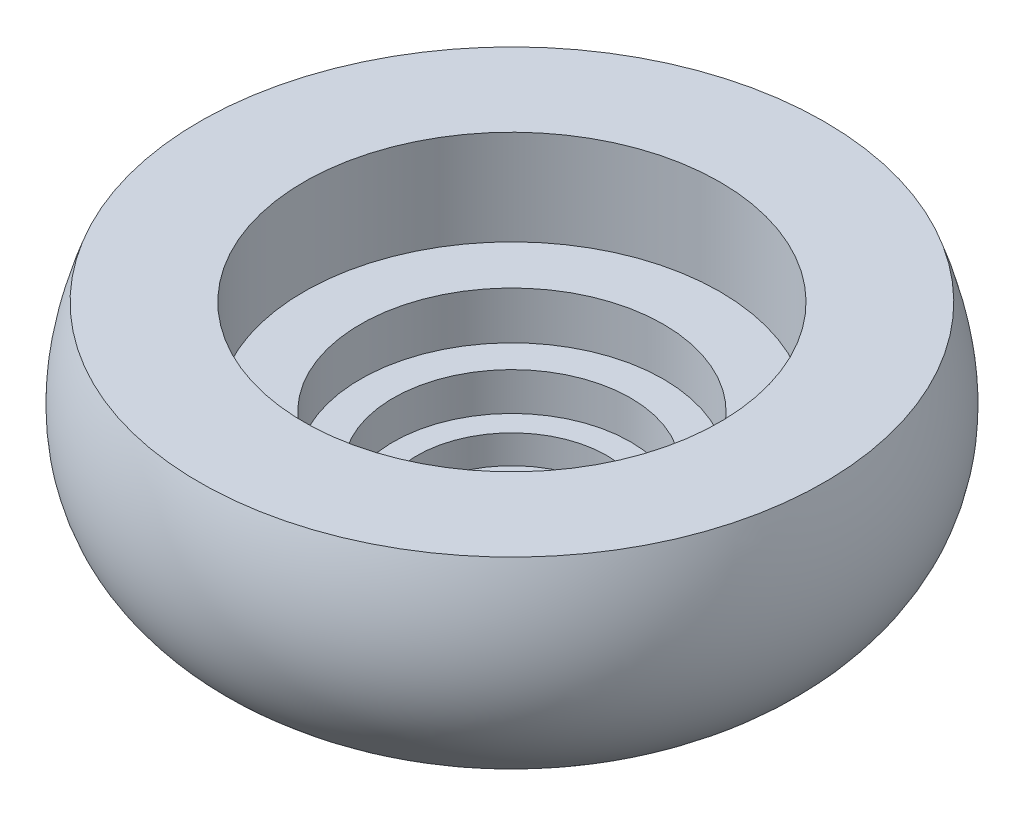
ISO-10303-21;
HEADER;
FILE_DESCRIPTION(('STEP AP214'),'2;1');
FILE_NAME('part.step','',(''),(''),'','','');
FILE_SCHEMA(('AUTOMOTIVE_DESIGN { 1 0 10303 214 1 1 1 1 }'));
ENDSEC;
DATA;
#1=APPLICATION_CONTEXT('core data for automotive mechanical design processes');
#2=APPLICATION_PROTOCOL_DEFINITION('international standard','automotive_design',2000,#1);
#3=PRODUCT_CONTEXT('',#1,'mechanical');
#4=PRODUCT('Part','Part','',(#3));
#5=PRODUCT_RELATED_PRODUCT_CATEGORY('part','',(#4));
#6=PRODUCT_DEFINITION_FORMATION('','',#4);
#7=PRODUCT_DEFINITION_CONTEXT('part definition',#1,'design');
#8=PRODUCT_DEFINITION('design','',#6,#7);
#9=PRODUCT_DEFINITION_SHAPE('','',#8);
#10=(LENGTH_UNIT() NAMED_UNIT(*) SI_UNIT(.MILLI.,.METRE.));
#11=(NAMED_UNIT(*) PLANE_ANGLE_UNIT() SI_UNIT($,.RADIAN.));
#12=(NAMED_UNIT(*) SI_UNIT($,.STERADIAN.) SOLID_ANGLE_UNIT());
#13=UNCERTAINTY_MEASURE_WITH_UNIT(LENGTH_MEASURE(1.E-05),#10,'distance_accuracy_value','');
#14=(GEOMETRIC_REPRESENTATION_CONTEXT(3) GLOBAL_UNCERTAINTY_ASSIGNED_CONTEXT((#13)) GLOBAL_UNIT_ASSIGNED_CONTEXT((#10,
#11,#12)) REPRESENTATION_CONTEXT('',''));
#15=CARTESIAN_POINT('',(0.,0.,0.));
#16=DIRECTION('',(0.,0.,1.));
#17=DIRECTION('',(1.,0.,0.));
#18=AXIS2_PLACEMENT_3D('',#15,#16,#17);
#19=CARTESIAN_POINT('',(-5.,0.,0.));
#20=CARTESIAN_POINT('',(-19.4223909581943,1.11577590500392,0.));
#21=CARTESIAN_POINT('',(-41.1148077799742,7.04489841037316,0.));
#22=CARTESIAN_POINT('',(-32.9,30.,0.));
#23=B_SPLINE_CURVE_WITH_KNOTS('',3,(#19,#20,#21,#22),.UNSPECIFIED.,.F.,.F.,(4,4),(0.,1.),.UNSPECIFIED.);
#24=CARTESIAN_POINT('',(0.,0.,0.));
#25=DIRECTION('',(0.,-1.,0.));
#26=AXIS1_PLACEMENT('',#24,#25);
#27=SURFACE_OF_REVOLUTION('',#23,#26);
#28=CARTESIAN_POINT('',(0.,30.,0.));
#29=DIRECTION('',(0.,-1.,0.));
#30=DIRECTION('',(0.,0.,-1.));
#31=AXIS2_PLACEMENT_3D('',#28,#29,#30);
#32=CIRCLE('',#31,32.9);
#33=CARTESIAN_POINT('',(0.,30.,-32.9));
#34=VERTEX_POINT('',#33);
#35=EDGE_CURVE('E83',#34,#34,#32,.T.);
#36=ORIENTED_EDGE('',*,*,#35,.T.);
#37=EDGE_LOOP('',(#36));
#38=FACE_BOUND('',#37,.T.);
#39=CARTESIAN_POINT('',(0.,0.,0.));
#40=DIRECTION('',(0.,-1.,0.));
#41=DIRECTION('',(0.,0.,-1.));
#42=AXIS2_PLACEMENT_3D('',#39,#40,#41);
#43=CIRCLE('',#42,5.);
#44=CARTESIAN_POINT('',(0.,0.,-5.));
#45=VERTEX_POINT('',#44);
#46=EDGE_CURVE('E10',#45,#45,#43,.T.);
#47=ORIENTED_EDGE('',*,*,#46,.F.);
#48=EDGE_LOOP('',(#47));
#49=FACE_BOUND('',#48,.T.);
#50=ADVANCED_FACE('F39',(#38,#49),#27,.F.);
#51=CARTESIAN_POINT('',(0.,0.,0.));
#52=DIRECTION('',(0.,-1.,0.));
#53=DIRECTION('',(0.,0.,-1.));
#54=AXIS2_PLACEMENT_3D('',#51,#52,#53);
#55=PLANE('',#54);
#56=ORIENTED_EDGE('',*,*,#46,.T.);
#57=EDGE_LOOP('',(#56));
#58=FACE_BOUND('',#57,.T.);
#59=ADVANCED_FACE('F114',(#58),#55,.T.);
#60=CARTESIAN_POINT('',(0.,8.,0.));
#61=DIRECTION('',(0.,1.,0.));
#62=DIRECTION('',(0.,0.,1.));
#63=AXIS2_PLACEMENT_3D('',#60,#61,#62);
#64=PLANE('',#63);
#65=CARTESIAN_POINT('',(0.,8.,0.));
#66=DIRECTION('',(0.,-1.,0.));
#67=DIRECTION('',(0.,0.,-1.));
#68=AXIS2_PLACEMENT_3D('',#65,#66,#67);
#69=CIRCLE('',#68,10.);
#70=CARTESIAN_POINT('',(0.,8.,-10.));
#71=VERTEX_POINT('',#70);
#72=EDGE_CURVE('E47',#71,#71,#69,.T.);
#73=ORIENTED_EDGE('',*,*,#72,.F.);
#74=EDGE_LOOP('',(#73));
#75=FACE_BOUND('',#74,.T.);
#76=ADVANCED_FACE('F118',(#75),#64,.T.);
#77=CARTESIAN_POINT('',(0.,0.,0.));
#78=DIRECTION('',(0.,-1.,0.));
#79=DIRECTION('',(0.,0.,-1.));
#80=AXIS2_PLACEMENT_3D('',#77,#78,#79);
#81=CYLINDRICAL_SURFACE('',#80,10.);
#82=ORIENTED_EDGE('',*,*,#72,.T.);
#83=EDGE_LOOP('',(#82));
#84=FACE_BOUND('',#83,.T.);
#85=CARTESIAN_POINT('',(0.,11.,0.));
#86=DIRECTION('',(0.,-1.,0.));
#87=DIRECTION('',(0.,0.,-1.));
#88=AXIS2_PLACEMENT_3D('',#85,#86,#87);
#89=CIRCLE('',#88,10.);
#90=CARTESIAN_POINT('',(0.,11.,-10.));
#91=VERTEX_POINT('',#90);
#92=EDGE_CURVE('E52',#91,#91,#89,.T.);
#93=ORIENTED_EDGE('',*,*,#92,.F.);
#94=EDGE_LOOP('',(#93));
#95=FACE_BOUND('',#94,.T.);
#96=ADVANCED_FACE('F122',(#84,#95),#81,.F.);
#97=CARTESIAN_POINT('',(0.,11.,0.));
#98=DIRECTION('',(0.,1.,0.));
#99=DIRECTION('',(0.,0.,1.));
#100=AXIS2_PLACEMENT_3D('',#97,#98,#99);
#101=PLANE('',#100);
#102=ORIENTED_EDGE('',*,*,#92,.T.);
#103=EDGE_LOOP('',(#102));
#104=FACE_BOUND('',#103,.T.);
#105=CARTESIAN_POINT('',(0.,11.,0.));
#106=DIRECTION('',(0.,-1.,0.));
#107=DIRECTION('',(0.,0.,-1.));
#108=AXIS2_PLACEMENT_3D('',#105,#106,#107);
#109=CIRCLE('',#108,12.5);
#110=CARTESIAN_POINT('',(0.,11.,-12.5));
#111=VERTEX_POINT('',#110);
#112=EDGE_CURVE('E57',#111,#111,#109,.T.);
#113=ORIENTED_EDGE('',*,*,#112,.F.);
#114=EDGE_LOOP('',(#113));
#115=FACE_BOUND('',#114,.T.);
#116=ADVANCED_FACE('F128',(#104,#115),#101,.T.);
#117=CARTESIAN_POINT('',(0.,0.,0.));
#118=DIRECTION('',(0.,-1.,0.));
#119=DIRECTION('',(0.,0.,-1.));
#120=AXIS2_PLACEMENT_3D('',#117,#118,#119);
#121=CYLINDRICAL_SURFACE('',#120,12.5);
#122=ORIENTED_EDGE('',*,*,#112,.T.);
#123=EDGE_LOOP('',(#122));
#124=FACE_BOUND('',#123,.T.);
#125=CARTESIAN_POINT('',(0.,15.,0.));
#126=DIRECTION('',(0.,-1.,0.));
#127=DIRECTION('',(0.,0.,-1.));
#128=AXIS2_PLACEMENT_3D('',#125,#126,#127);
#129=CIRCLE('',#128,12.5);
#130=CARTESIAN_POINT('',(0.,15.,-12.5));
#131=VERTEX_POINT('',#130);
#132=EDGE_CURVE('E63',#131,#131,#129,.T.);
#133=ORIENTED_EDGE('',*,*,#132,.F.);
#134=EDGE_LOOP('',(#133));
#135=FACE_BOUND('',#134,.T.);
#136=ADVANCED_FACE('F131',(#124,#135),#121,.F.);
#137=CARTESIAN_POINT('',(0.,15.,0.));
#138=DIRECTION('',(0.,1.,0.));
#139=DIRECTION('',(0.,0.,1.));
#140=AXIS2_PLACEMENT_3D('',#137,#138,#139);
#141=PLANE('',#140);
#142=ORIENTED_EDGE('',*,*,#132,.T.);
#143=EDGE_LOOP('',(#142));
#144=FACE_BOUND('',#143,.T.);
#145=CARTESIAN_POINT('',(0.,15.,0.));
#146=DIRECTION('',(0.,-1.,0.));
#147=DIRECTION('',(0.,0.,-1.));
#148=AXIS2_PLACEMENT_3D('',#145,#146,#147);
#149=CIRCLE('',#148,15.95);
#150=CARTESIAN_POINT('',(0.,15.,-15.95));
#151=VERTEX_POINT('',#150);
#152=EDGE_CURVE('E67',#151,#151,#149,.T.);
#153=ORIENTED_EDGE('',*,*,#152,.F.);
#154=EDGE_LOOP('',(#153));
#155=FACE_BOUND('',#154,.T.);
#156=ADVANCED_FACE('F135',(#144,#155),#141,.T.);
#157=CARTESIAN_POINT('',(0.,0.,0.));
#158=DIRECTION('',(0.,-1.,0.));
#159=DIRECTION('',(0.,0.,-1.));
#160=AXIS2_PLACEMENT_3D('',#157,#158,#159);
#161=CYLINDRICAL_SURFACE('',#160,15.95);
#162=ORIENTED_EDGE('',*,*,#152,.T.);
#163=EDGE_LOOP('',(#162));
#164=FACE_BOUND('',#163,.T.);
#165=CARTESIAN_POINT('',(0.,20.,0.));
#166=DIRECTION('',(0.,-1.,0.));
#167=DIRECTION('',(0.,0.,-1.));
#168=AXIS2_PLACEMENT_3D('',#165,#166,#167);
#169=CIRCLE('',#168,15.95);
#170=CARTESIAN_POINT('',(0.,20.,-15.95));
#171=VERTEX_POINT('',#170);
#172=EDGE_CURVE('E71',#171,#171,#169,.T.);
#173=ORIENTED_EDGE('',*,*,#172,.F.);
#174=EDGE_LOOP('',(#173));
#175=FACE_BOUND('',#174,.T.);
#176=ADVANCED_FACE('F110',(#164,#175),#161,.F.);
#177=CARTESIAN_POINT('',(0.,20.,0.));
#178=DIRECTION('',(0.,1.,0.));
#179=DIRECTION('',(0.,0.,1.));
#180=AXIS2_PLACEMENT_3D('',#177,#178,#179);
#181=PLANE('',#180);
#182=ORIENTED_EDGE('',*,*,#172,.T.);
#183=EDGE_LOOP('',(#182));
#184=FACE_BOUND('',#183,.T.);
#185=CARTESIAN_POINT('',(0.,20.,0.));
#186=DIRECTION('',(0.,-1.,0.));
#187=DIRECTION('',(0.,0.,-1.));
#188=AXIS2_PLACEMENT_3D('',#185,#186,#187);
#189=CIRCLE('',#188,21.9);
#190=CARTESIAN_POINT('',(0.,20.,-21.9));
#191=VERTEX_POINT('',#190);
#192=EDGE_CURVE('E75',#191,#191,#189,.T.);
#193=ORIENTED_EDGE('',*,*,#192,.F.);
#194=EDGE_LOOP('',(#193));
#195=FACE_BOUND('',#194,.T.);
#196=ADVANCED_FACE('F104',(#184,#195),#181,.T.);
#197=CARTESIAN_POINT('',(0.,0.,0.));
#198=DIRECTION('',(0.,-1.,0.));
#199=DIRECTION('',(0.,0.,-1.));
#200=AXIS2_PLACEMENT_3D('',#197,#198,#199);
#201=CYLINDRICAL_SURFACE('',#200,21.9);
#202=ORIENTED_EDGE('',*,*,#192,.T.);
#203=EDGE_LOOP('',(#202));
#204=FACE_BOUND('',#203,.T.);
#205=CARTESIAN_POINT('',(0.,30.,0.));
#206=DIRECTION('',(0.,-1.,0.));
#207=DIRECTION('',(0.,0.,-1.));
#208=AXIS2_PLACEMENT_3D('',#205,#206,#207);
#209=CIRCLE('',#208,21.9);
#210=CARTESIAN_POINT('',(0.,30.,-21.9));
#211=VERTEX_POINT('',#210);
#212=EDGE_CURVE('E79',#211,#211,#209,.T.);
#213=ORIENTED_EDGE('',*,*,#212,.F.);
#214=EDGE_LOOP('',(#213));
#215=FACE_BOUND('',#214,.T.);
#216=ADVANCED_FACE('F99',(#204,#215),#201,.F.);
#217=CARTESIAN_POINT('',(0.,30.,0.));
#218=DIRECTION('',(0.,-1.,0.));
#219=DIRECTION('',(0.,0.,-1.));
#220=AXIS2_PLACEMENT_3D('',#217,#218,#219);
#221=PLANE('',#220);
#222=ORIENTED_EDGE('',*,*,#35,.F.);
#223=EDGE_LOOP('',(#222));
#224=FACE_BOUND('',#223,.T.);
#225=ORIENTED_EDGE('',*,*,#212,.T.);
#226=EDGE_LOOP('',(#225));
#227=FACE_BOUND('',#226,.T.);
#228=ADVANCED_FACE('F96',(#224,#227),#221,.F.);
#229=CLOSED_SHELL('',(#50,#59,#76,#96,#116,#136,#156,#176,#196,#216,#228));
#230=MANIFOLD_SOLID_BREP('B2',#229);
#231=ADVANCED_BREP_SHAPE_REPRESENTATION('',(#18,#230),#14);
#232=SHAPE_DEFINITION_REPRESENTATION(#9,#231);
ENDSEC;
END-ISO-10303-21;
